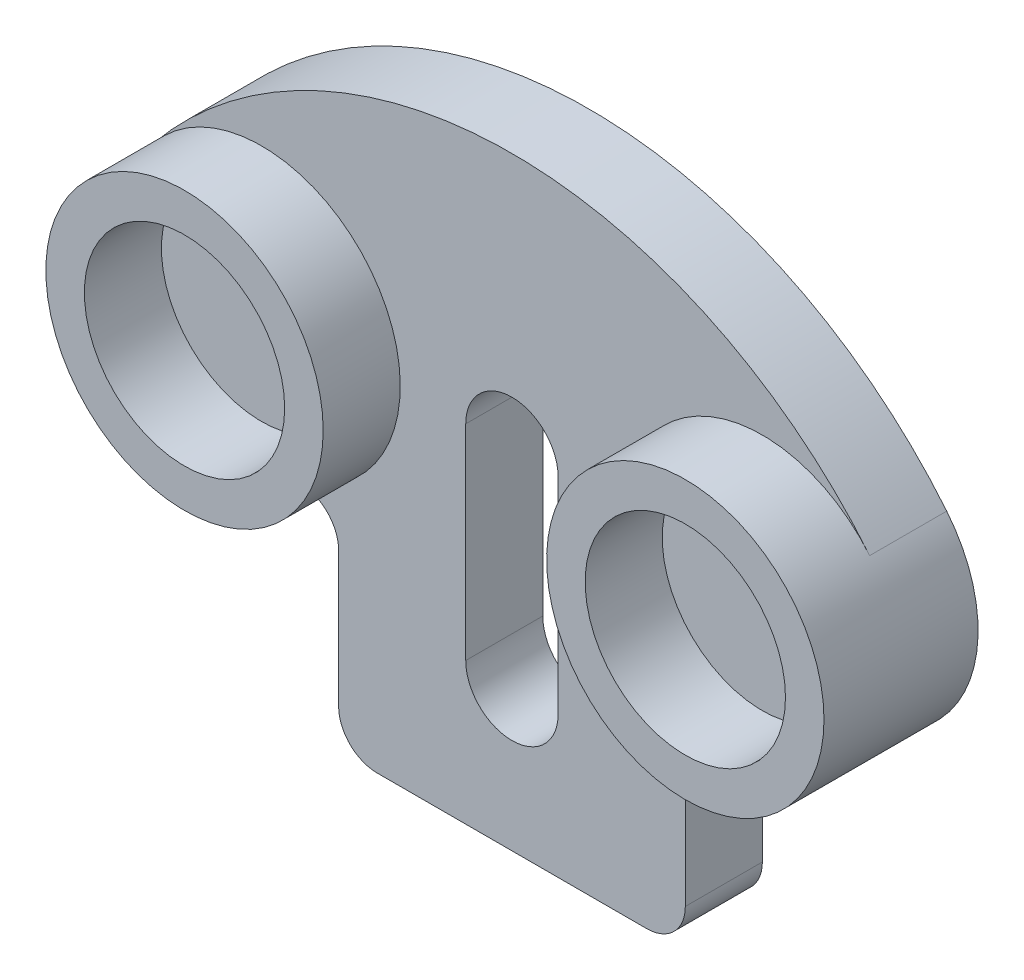
ISO-10303-21;
HEADER;
FILE_DESCRIPTION(('STEP AP214'),'2;1');
FILE_NAME('part.step','',(''),(''),'','','');
FILE_SCHEMA(('AUTOMOTIVE_DESIGN { 1 0 10303 214 1 1 1 1 }'));
ENDSEC;
DATA;
#1=APPLICATION_CONTEXT('core data for automotive mechanical design processes');
#2=APPLICATION_PROTOCOL_DEFINITION('international standard','automotive_design',2000,#1);
#3=PRODUCT_CONTEXT('',#1,'mechanical');
#4=PRODUCT('Part','Part','',(#3));
#5=PRODUCT_RELATED_PRODUCT_CATEGORY('part','',(#4));
#6=PRODUCT_DEFINITION_FORMATION('','',#4);
#7=PRODUCT_DEFINITION_CONTEXT('part definition',#1,'design');
#8=PRODUCT_DEFINITION('design','',#6,#7);
#9=PRODUCT_DEFINITION_SHAPE('','',#8);
#10=(LENGTH_UNIT() NAMED_UNIT(*) SI_UNIT(.MILLI.,.METRE.));
#11=(NAMED_UNIT(*) PLANE_ANGLE_UNIT() SI_UNIT($,.RADIAN.));
#12=(NAMED_UNIT(*) SI_UNIT($,.STERADIAN.) SOLID_ANGLE_UNIT());
#13=UNCERTAINTY_MEASURE_WITH_UNIT(LENGTH_MEASURE(1.E-05),#10,'distance_accuracy_value','');
#14=(GEOMETRIC_REPRESENTATION_CONTEXT(3) GLOBAL_UNCERTAINTY_ASSIGNED_CONTEXT((#13)) GLOBAL_UNIT_ASSIGNED_CONTEXT((#10,
#11,#12)) REPRESENTATION_CONTEXT('',''));
#15=CARTESIAN_POINT('',(0.,0.,0.));
#16=DIRECTION('',(0.,0.,1.));
#17=DIRECTION('',(1.,0.,0.));
#18=AXIS2_PLACEMENT_3D('',#15,#16,#17);
#19=CARTESIAN_POINT('',(0.,0.,10.));
#20=DIRECTION('',(0.,0.,1.));
#21=DIRECTION('',(1.,0.,0.));
#22=AXIS2_PLACEMENT_3D('',#19,#20,#21);
#23=PLANE('',#22);
#24=CARTESIAN_POINT('',(0.,26.6035711888461,10.));
#25=DIRECTION('',(0.,0.,1.));
#26=DIRECTION('',(1.,0.,0.));
#27=AXIS2_PLACEMENT_3D('',#24,#25,#26);
#28=CIRCLE('',#27,6.00000000000001);
#29=CARTESIAN_POINT('',(6.00000000000001,26.6035711888461,10.));
#30=VERTEX_POINT('',#29);
#31=CARTESIAN_POINT('',(-6.00000000000001,26.6035711888461,10.));
#32=VERTEX_POINT('',#31);
#33=EDGE_CURVE('E241',#30,#32,#28,.T.);
#34=ORIENTED_EDGE('',*,*,#33,.F.);
#35=DIRECTION('',(0.,-1.,0.));
#36=VECTOR('',#35,1.);
#37=CARTESIAN_POINT('',(6.,0.,10.));
#38=LINE('',#37,#36);
#39=CARTESIAN_POINT('',(6.,0.,10.));
#40=VERTEX_POINT('',#39);
#41=EDGE_CURVE('E298',#30,#40,#38,.T.);
#42=ORIENTED_EDGE('',*,*,#41,.T.);
#43=CARTESIAN_POINT('',(0.,0.,10.));
#44=DIRECTION('',(0.,0.,1.));
#45=DIRECTION('',(1.,0.,0.));
#46=AXIS2_PLACEMENT_3D('',#43,#44,#45);
#47=CIRCLE('',#46,6.);
#48=CARTESIAN_POINT('',(-6.,0.,10.));
#49=VERTEX_POINT('',#48);
#50=EDGE_CURVE('E300',#49,#40,#47,.T.);
#51=ORIENTED_EDGE('',*,*,#50,.F.);
#52=DIRECTION('',(0.,1.,0.));
#53=VECTOR('',#52,1.);
#54=CARTESIAN_POINT('',(-6.,0.,10.));
#55=LINE('',#54,#53);
#56=EDGE_CURVE('E293',#49,#32,#55,.T.);
#57=ORIENTED_EDGE('',*,*,#56,.T.);
#58=EDGE_LOOP('',(#34,#42,#51,#57));
#59=FACE_BOUND('',#58,.T.);
#60=CARTESIAN_POINT('',(0.,0.,10.));
#61=DIRECTION('',(0.,0.,1.));
#62=DIRECTION('',(1.,0.,0.));
#63=AXIS2_PLACEMENT_3D('',#60,#61,#62);
#64=CIRCLE('',#63,60.);
#65=CARTESIAN_POINT('',(46.4285714285714,38.0051016983515,10.));
#66=VERTEX_POINT('',#65);
#67=CARTESIAN_POINT('',(-46.4285714285714,38.0051016983515,10.));
#68=VERTEX_POINT('',#67);
#69=EDGE_CURVE('E285',#66,#68,#64,.T.);
#70=ORIENTED_EDGE('',*,*,#69,.T.);
#71=CARTESIAN_POINT('',(-32.5,26.6035711888461,10.));
#72=DIRECTION('',(0.,0.,1.));
#73=DIRECTION('',(1.,0.,0.));
#74=AXIS2_PLACEMENT_3D('',#71,#72,#73);
#75=CIRCLE('',#74,18.);
#76=CARTESIAN_POINT('',(-28.5869565217391,9.0340495466032,10.));
#77=VERTEX_POINT('',#76);
#78=EDGE_CURVE('E85',#68,#77,#75,.F.);
#79=ORIENTED_EDGE('',*,*,#78,.T.);
#80=CARTESIAN_POINT('',(-27.5,4.1536268682024,10.));
#81=DIRECTION('',(0.,0.,1.));
#82=DIRECTION('',(1.,0.,0.));
#83=AXIS2_PLACEMENT_3D('',#80,#81,#82);
#84=CIRCLE('',#83,5.);
#85=CARTESIAN_POINT('',(-22.5,4.1536268682024,10.));
#86=VERTEX_POINT('',#85);
#87=EDGE_CURVE('E279',#86,#77,#84,.T.);
#88=ORIENTED_EDGE('',*,*,#87,.F.);
#89=DIRECTION('',(0.,1.,0.));
#90=VECTOR('',#89,1.);
#91=CARTESIAN_POINT('',(-22.5,0.,10.));
#92=LINE('',#91,#90);
#93=CARTESIAN_POINT('',(-22.5,-13.3964288111539,10.));
#94=VERTEX_POINT('',#93);
#95=EDGE_CURVE('E204',#94,#86,#92,.T.);
#96=ORIENTED_EDGE('',*,*,#95,.F.);
#97=CARTESIAN_POINT('',(-17.5,-13.3964288111539,10.));
#98=DIRECTION('',(0.,0.,1.));
#99=DIRECTION('',(1.,0.,0.));
#100=AXIS2_PLACEMENT_3D('',#97,#98,#99);
#101=CIRCLE('',#100,5.);
#102=CARTESIAN_POINT('',(-17.5,-18.3964288111539,10.));
#103=VERTEX_POINT('',#102);
#104=EDGE_CURVE('E205',#103,#94,#101,.F.);
#105=ORIENTED_EDGE('',*,*,#104,.F.);
#106=DIRECTION('',(-1.,0.,0.));
#107=VECTOR('',#106,1.);
#108=CARTESIAN_POINT('',(0.,-18.3964288111539,10.));
#109=LINE('',#108,#107);
#110=CARTESIAN_POINT('',(17.5,-18.3964288111539,10.));
#111=VERTEX_POINT('',#110);
#112=EDGE_CURVE('E186',#111,#103,#109,.T.);
#113=ORIENTED_EDGE('',*,*,#112,.F.);
#114=CARTESIAN_POINT('',(17.5,-13.3964288111539,10.));
#115=DIRECTION('',(0.,0.,1.));
#116=DIRECTION('',(1.,0.,0.));
#117=AXIS2_PLACEMENT_3D('',#114,#115,#116);
#118=CIRCLE('',#117,5.);
#119=CARTESIAN_POINT('',(22.5,-13.3964288111539,10.));
#120=VERTEX_POINT('',#119);
#121=EDGE_CURVE('E195',#111,#120,#118,.T.);
#122=ORIENTED_EDGE('',*,*,#121,.T.);
#123=DIRECTION('',(0.,1.,0.));
#124=VECTOR('',#123,1.);
#125=CARTESIAN_POINT('',(22.5,0.,10.));
#126=LINE('',#125,#124);
#127=CARTESIAN_POINT('',(22.5,4.1536268682024,10.));
#128=VERTEX_POINT('',#127);
#129=EDGE_CURVE('E91',#120,#128,#126,.T.);
#130=ORIENTED_EDGE('',*,*,#129,.T.);
#131=CARTESIAN_POINT('',(27.5,4.1536268682024,10.));
#132=DIRECTION('',(0.,0.,1.));
#133=DIRECTION('',(1.,0.,0.));
#134=AXIS2_PLACEMENT_3D('',#131,#132,#133);
#135=CIRCLE('',#134,5.);
#136=CARTESIAN_POINT('',(28.5869565217391,9.03404954660319,10.));
#137=VERTEX_POINT('',#136);
#138=EDGE_CURVE('E292',#128,#137,#135,.F.);
#139=ORIENTED_EDGE('',*,*,#138,.T.);
#140=CARTESIAN_POINT('',(32.5,26.6035711888461,10.));
#141=DIRECTION('',(0.,0.,1.));
#142=DIRECTION('',(1.,0.,0.));
#143=AXIS2_PLACEMENT_3D('',#140,#141,#142);
#144=CIRCLE('',#143,18.);
#145=EDGE_CURVE('E261',#66,#137,#144,.T.);
#146=ORIENTED_EDGE('',*,*,#145,.F.);
#147=EDGE_LOOP('',(#70,#79,#88,#96,#105,#113,#122,#130,#139,#146));
#148=FACE_BOUND('',#147,.T.);
#149=ADVANCED_FACE('F77',(#59,#148),#23,.T.);
#150=CARTESIAN_POINT('',(32.5,26.6035711888461,10.));
#151=DIRECTION('',(0.,0.,-1.));
#152=DIRECTION('',(-1.,0.,0.));
#153=AXIS2_PLACEMENT_3D('',#150,#151,#152);
#154=CYLINDRICAL_SURFACE('',#153,18.);
#155=CARTESIAN_POINT('',(32.5,26.6035711888461,0.));
#156=DIRECTION('',(0.,0.,1.));
#157=DIRECTION('',(1.,0.,0.));
#158=AXIS2_PLACEMENT_3D('',#155,#156,#157);
#159=CIRCLE('',#158,18.);
#160=CARTESIAN_POINT('',(46.4285714285714,38.0051016983515,0.));
#161=VERTEX_POINT('',#160);
#162=CARTESIAN_POINT('',(28.5869565217391,9.03404954660319,0.));
#163=VERTEX_POINT('',#162);
#164=EDGE_CURVE('E227',#161,#163,#159,.F.);
#165=ORIENTED_EDGE('',*,*,#164,.F.);
#166=DIRECTION('',(0.,0.,-1.));
#167=VECTOR('',#166,1.);
#168=CARTESIAN_POINT('',(46.4285714285714,38.0051016983515,10.));
#169=LINE('',#168,#167);
#170=EDGE_CURVE('E260',#66,#161,#169,.T.);
#171=ORIENTED_EDGE('',*,*,#170,.F.);
#172=ORIENTED_EDGE('',*,*,#145,.T.);
#173=DIRECTION('',(0.,0.,-1.));
#174=VECTOR('',#173,1.);
#175=CARTESIAN_POINT('',(28.5869565217391,9.03404954660319,10.));
#176=LINE('',#175,#174);
#177=EDGE_CURVE('E259',#137,#163,#176,.T.);
#178=ORIENTED_EDGE('',*,*,#177,.T.);
#179=EDGE_LOOP('',(#165,#171,#172,#178));
#180=FACE_BOUND('',#179,.T.);
#181=CARTESIAN_POINT('',(32.5,26.6035711888461,20.));
#182=DIRECTION('',(0.,0.,1.));
#183=DIRECTION('',(1.,0.,0.));
#184=AXIS2_PLACEMENT_3D('',#181,#182,#183);
#185=CIRCLE('',#184,18.);
#186=CARTESIAN_POINT('',(50.5,26.6035711888461,20.));
#187=VERTEX_POINT('',#186);
#188=EDGE_CURVE('E307',#187,#187,#185,.F.);
#189=ORIENTED_EDGE('',*,*,#188,.T.);
#190=EDGE_LOOP('',(#189));
#191=FACE_BOUND('',#190,.T.);
#192=ADVANCED_FACE('F340',(#180,#191),#154,.T.);
#193=CARTESIAN_POINT('',(0.,0.,10.));
#194=DIRECTION('',(0.,0.,-1.));
#195=DIRECTION('',(-1.,0.,0.));
#196=AXIS2_PLACEMENT_3D('',#193,#194,#195);
#197=CYLINDRICAL_SURFACE('',#196,60.);
#198=CARTESIAN_POINT('',(0.,0.,0.));
#199=DIRECTION('',(0.,0.,1.));
#200=DIRECTION('',(1.,0.,0.));
#201=AXIS2_PLACEMENT_3D('',#198,#199,#200);
#202=CIRCLE('',#201,60.);
#203=CARTESIAN_POINT('',(-46.4285714285714,38.0051016983515,0.));
#204=VERTEX_POINT('',#203);
#205=EDGE_CURVE('E226',#161,#204,#202,.T.);
#206=ORIENTED_EDGE('',*,*,#205,.T.);
#207=DIRECTION('',(0.,0.,-1.));
#208=VECTOR('',#207,1.);
#209=CARTESIAN_POINT('',(-46.4285714285714,38.0051016983515,10.));
#210=LINE('',#209,#208);
#211=EDGE_CURVE('E254',#68,#204,#210,.T.);
#212=ORIENTED_EDGE('',*,*,#211,.F.);
#213=ORIENTED_EDGE('',*,*,#69,.F.);
#214=ORIENTED_EDGE('',*,*,#170,.T.);
#215=EDGE_LOOP('',(#206,#212,#213,#214));
#216=FACE_BOUND('',#215,.T.);
#217=ADVANCED_FACE('F345',(#216),#197,.T.);
#218=CARTESIAN_POINT('',(-27.5,4.1536268682024,10.));
#219=DIRECTION('',(0.,0.,-1.));
#220=DIRECTION('',(-1.,0.,0.));
#221=AXIS2_PLACEMENT_3D('',#218,#219,#220);
#222=CYLINDRICAL_SURFACE('',#221,5.);
#223=CARTESIAN_POINT('',(-27.5,4.1536268682024,0.));
#224=DIRECTION('',(0.,0.,1.));
#225=DIRECTION('',(1.,0.,0.));
#226=AXIS2_PLACEMENT_3D('',#223,#224,#225);
#227=CIRCLE('',#226,5.);
#228=CARTESIAN_POINT('',(-22.5,4.1536268682024,0.));
#229=VERTEX_POINT('',#228);
#230=CARTESIAN_POINT('',(-28.5869565217391,9.0340495466032,0.));
#231=VERTEX_POINT('',#230);
#232=EDGE_CURVE('E232',#229,#231,#227,.T.);
#233=ORIENTED_EDGE('',*,*,#232,.F.);
#234=DIRECTION('',(0.,0.,-1.));
#235=VECTOR('',#234,1.);
#236=CARTESIAN_POINT('',(-22.5,4.1536268682024,10.));
#237=LINE('',#236,#235);
#238=EDGE_CURVE('E253',#86,#229,#237,.T.);
#239=ORIENTED_EDGE('',*,*,#238,.F.);
#240=ORIENTED_EDGE('',*,*,#87,.T.);
#241=DIRECTION('',(0.,0.,-1.));
#242=VECTOR('',#241,1.);
#243=CARTESIAN_POINT('',(-28.5869565217391,9.0340495466032,10.));
#244=LINE('',#243,#242);
#245=EDGE_CURVE('E251',#77,#231,#244,.T.);
#246=ORIENTED_EDGE('',*,*,#245,.T.);
#247=EDGE_LOOP('',(#233,#239,#240,#246));
#248=FACE_BOUND('',#247,.T.);
#249=ADVANCED_FACE('F288',(#248),#222,.F.);
#250=CARTESIAN_POINT('',(-22.5,0.,10.));
#251=DIRECTION('',(-1.,0.,0.));
#252=DIRECTION('',(0.,0.,1.));
#253=AXIS2_PLACEMENT_3D('',#250,#251,#252);
#254=PLANE('',#253);
#255=DIRECTION('',(0.,1.,0.));
#256=VECTOR('',#255,1.);
#257=CARTESIAN_POINT('',(-22.5,0.,0.));
#258=LINE('',#257,#256);
#259=CARTESIAN_POINT('',(-22.5,-13.3964288111539,0.));
#260=VERTEX_POINT('',#259);
#261=EDGE_CURVE('E235',#260,#229,#258,.T.);
#262=ORIENTED_EDGE('',*,*,#261,.F.);
#263=DIRECTION('',(0.,0.,-1.));
#264=VECTOR('',#263,1.);
#265=CARTESIAN_POINT('',(-22.5,-13.3964288111539,10.));
#266=LINE('',#265,#264);
#267=EDGE_CURVE('E248',#94,#260,#266,.T.);
#268=ORIENTED_EDGE('',*,*,#267,.F.);
#269=ORIENTED_EDGE('',*,*,#95,.T.);
#270=ORIENTED_EDGE('',*,*,#238,.T.);
#271=EDGE_LOOP('',(#262,#268,#269,#270));
#272=FACE_BOUND('',#271,.T.);
#273=ADVANCED_FACE('F491',(#272),#254,.T.);
#274=CARTESIAN_POINT('',(-17.5,-13.3964288111539,10.));
#275=DIRECTION('',(0.,0.,-1.));
#276=DIRECTION('',(-1.,0.,0.));
#277=AXIS2_PLACEMENT_3D('',#274,#275,#276);
#278=CYLINDRICAL_SURFACE('',#277,5.);
#279=CARTESIAN_POINT('',(-17.5,-13.3964288111539,0.));
#280=DIRECTION('',(0.,0.,1.));
#281=DIRECTION('',(1.,0.,0.));
#282=AXIS2_PLACEMENT_3D('',#279,#280,#281);
#283=CIRCLE('',#282,5.);
#284=CARTESIAN_POINT('',(-17.5,-18.3964288111539,0.));
#285=VERTEX_POINT('',#284);
#286=EDGE_CURVE('E236',#285,#260,#283,.F.);
#287=ORIENTED_EDGE('',*,*,#286,.F.);
#288=DIRECTION('',(0.,0.,-1.));
#289=VECTOR('',#288,1.);
#290=CARTESIAN_POINT('',(-17.5,-18.3964288111539,10.));
#291=LINE('',#290,#289);
#292=EDGE_CURVE('E192',#103,#285,#291,.T.);
#293=ORIENTED_EDGE('',*,*,#292,.F.);
#294=ORIENTED_EDGE('',*,*,#104,.T.);
#295=ORIENTED_EDGE('',*,*,#267,.T.);
#296=EDGE_LOOP('',(#287,#293,#294,#295));
#297=FACE_BOUND('',#296,.T.);
#298=ADVANCED_FACE('F483',(#297),#278,.T.);
#299=CARTESIAN_POINT('',(0.,-18.3964288111539,10.));
#300=DIRECTION('',(0.,-1.,0.));
#301=DIRECTION('',(0.,0.,-1.));
#302=AXIS2_PLACEMENT_3D('',#299,#300,#301);
#303=PLANE('',#302);
#304=DIRECTION('',(-1.,0.,0.));
#305=VECTOR('',#304,1.);
#306=CARTESIAN_POINT('',(0.,-18.3964288111539,0.));
#307=LINE('',#306,#305);
#308=CARTESIAN_POINT('',(17.5,-18.3964288111539,0.));
#309=VERTEX_POINT('',#308);
#310=EDGE_CURVE('E191',#309,#285,#307,.T.);
#311=ORIENTED_EDGE('',*,*,#310,.F.);
#312=DIRECTION('',(0.,0.,-1.));
#313=VECTOR('',#312,1.);
#314=CARTESIAN_POINT('',(17.5,-18.3964288111539,10.));
#315=LINE('',#314,#313);
#316=EDGE_CURVE('E183',#111,#309,#315,.T.);
#317=ORIENTED_EDGE('',*,*,#316,.F.);
#318=ORIENTED_EDGE('',*,*,#112,.T.);
#319=ORIENTED_EDGE('',*,*,#292,.T.);
#320=EDGE_LOOP('',(#311,#317,#318,#319));
#321=FACE_BOUND('',#320,.T.);
#322=ADVANCED_FACE('F190',(#321),#303,.T.);
#323=CARTESIAN_POINT('',(17.5,-13.3964288111539,10.));
#324=DIRECTION('',(0.,0.,-1.));
#325=DIRECTION('',(-1.,0.,0.));
#326=AXIS2_PLACEMENT_3D('',#323,#324,#325);
#327=CYLINDRICAL_SURFACE('',#326,5.);
#328=CARTESIAN_POINT('',(17.5,-13.3964288111539,0.));
#329=DIRECTION('',(0.,0.,1.));
#330=DIRECTION('',(1.,0.,0.));
#331=AXIS2_PLACEMENT_3D('',#328,#329,#330);
#332=CIRCLE('',#331,5.);
#333=CARTESIAN_POINT('',(22.5,-13.3964288111539,0.));
#334=VERTEX_POINT('',#333);
#335=EDGE_CURVE('E140',#309,#334,#332,.T.);
#336=ORIENTED_EDGE('',*,*,#335,.T.);
#337=DIRECTION('',(0.,0.,-1.));
#338=VECTOR('',#337,1.);
#339=CARTESIAN_POINT('',(22.5,-13.3964288111539,10.));
#340=LINE('',#339,#338);
#341=EDGE_CURVE('E194',#120,#334,#340,.T.);
#342=ORIENTED_EDGE('',*,*,#341,.F.);
#343=ORIENTED_EDGE('',*,*,#121,.F.);
#344=ORIENTED_EDGE('',*,*,#316,.T.);
#345=EDGE_LOOP('',(#336,#342,#343,#344));
#346=FACE_BOUND('',#345,.T.);
#347=ADVANCED_FACE('F198',(#346),#327,.T.);
#348=CARTESIAN_POINT('',(22.5,0.,10.));
#349=DIRECTION('',(-1.,0.,0.));
#350=DIRECTION('',(0.,0.,1.));
#351=AXIS2_PLACEMENT_3D('',#348,#349,#350);
#352=PLANE('',#351);
#353=DIRECTION('',(0.,1.,0.));
#354=VECTOR('',#353,1.);
#355=CARTESIAN_POINT('',(22.5,0.,0.));
#356=LINE('',#355,#354);
#357=CARTESIAN_POINT('',(22.5,4.1536268682024,0.));
#358=VERTEX_POINT('',#357);
#359=EDGE_CURVE('E148',#334,#358,#356,.T.);
#360=ORIENTED_EDGE('',*,*,#359,.T.);
#361=DIRECTION('',(0.,0.,-1.));
#362=VECTOR('',#361,1.);
#363=CARTESIAN_POINT('',(22.5,4.1536268682024,10.));
#364=LINE('',#363,#362);
#365=EDGE_CURVE('E243',#128,#358,#364,.T.);
#366=ORIENTED_EDGE('',*,*,#365,.F.);
#367=ORIENTED_EDGE('',*,*,#129,.F.);
#368=ORIENTED_EDGE('',*,*,#341,.T.);
#369=EDGE_LOOP('',(#360,#366,#367,#368));
#370=FACE_BOUND('',#369,.T.);
#371=ADVANCED_FACE('F458',(#370),#352,.F.);
#372=CARTESIAN_POINT('',(27.5,4.1536268682024,10.));
#373=DIRECTION('',(0.,0.,-1.));
#374=DIRECTION('',(-1.,0.,0.));
#375=AXIS2_PLACEMENT_3D('',#372,#373,#374);
#376=CYLINDRICAL_SURFACE('',#375,5.);
#377=CARTESIAN_POINT('',(27.5,4.1536268682024,0.));
#378=DIRECTION('',(0.,0.,1.));
#379=DIRECTION('',(1.,0.,0.));
#380=AXIS2_PLACEMENT_3D('',#377,#378,#379);
#381=CIRCLE('',#380,5.);
#382=EDGE_CURVE('E224',#358,#163,#381,.F.);
#383=ORIENTED_EDGE('',*,*,#382,.T.);
#384=ORIENTED_EDGE('',*,*,#177,.F.);
#385=ORIENTED_EDGE('',*,*,#138,.F.);
#386=ORIENTED_EDGE('',*,*,#365,.T.);
#387=EDGE_LOOP('',(#383,#384,#385,#386));
#388=FACE_BOUND('',#387,.T.);
#389=ADVANCED_FACE('F451',(#388),#376,.F.);
#390=CARTESIAN_POINT('',(6.,0.,10.));
#391=DIRECTION('',(1.,0.,0.));
#392=DIRECTION('',(0.,1.,0.));
#393=AXIS2_PLACEMENT_3D('',#390,#391,#392);
#394=PLANE('',#393);
#395=DIRECTION('',(0.,-1.,0.));
#396=VECTOR('',#395,1.);
#397=CARTESIAN_POINT('',(6.,0.,0.));
#398=LINE('',#397,#396);
#399=CARTESIAN_POINT('',(6.00000000000001,26.6035711888461,0.));
#400=VERTEX_POINT('',#399);
#401=CARTESIAN_POINT('',(6.,0.,0.));
#402=VERTEX_POINT('',#401);
#403=EDGE_CURVE('E213',#400,#402,#398,.T.);
#404=ORIENTED_EDGE('',*,*,#403,.T.);
#405=DIRECTION('',(0.,0.,-1.));
#406=VECTOR('',#405,1.);
#407=CARTESIAN_POINT('',(6.,0.,10.));
#408=LINE('',#407,#406);
#409=EDGE_CURVE('E264',#40,#402,#408,.T.);
#410=ORIENTED_EDGE('',*,*,#409,.F.);
#411=ORIENTED_EDGE('',*,*,#41,.F.);
#412=DIRECTION('',(0.,0.,-1.));
#413=VECTOR('',#412,1.);
#414=CARTESIAN_POINT('',(6.00000000000001,26.6035711888461,10.));
#415=LINE('',#414,#413);
#416=EDGE_CURVE('E152',#30,#400,#415,.T.);
#417=ORIENTED_EDGE('',*,*,#416,.T.);
#418=EDGE_LOOP('',(#404,#410,#411,#417));
#419=FACE_BOUND('',#418,.T.);
#420=ADVANCED_FACE('F445',(#419),#394,.F.);
#421=CARTESIAN_POINT('',(0.,0.,10.));
#422=DIRECTION('',(0.,0.,-1.));
#423=DIRECTION('',(-1.,0.,0.));
#424=AXIS2_PLACEMENT_3D('',#421,#422,#423);
#425=CYLINDRICAL_SURFACE('',#424,6.);
#426=CARTESIAN_POINT('',(0.,0.,0.));
#427=DIRECTION('',(0.,0.,1.));
#428=DIRECTION('',(1.,0.,0.));
#429=AXIS2_PLACEMENT_3D('',#426,#427,#428);
#430=CIRCLE('',#429,6.);
#431=CARTESIAN_POINT('',(-6.,0.,0.));
#432=VERTEX_POINT('',#431);
#433=EDGE_CURVE('E220',#432,#402,#430,.T.);
#434=ORIENTED_EDGE('',*,*,#433,.F.);
#435=DIRECTION('',(0.,0.,-1.));
#436=VECTOR('',#435,1.);
#437=CARTESIAN_POINT('',(-6.,0.,10.));
#438=LINE('',#437,#436);
#439=EDGE_CURVE('E263',#49,#432,#438,.T.);
#440=ORIENTED_EDGE('',*,*,#439,.F.);
#441=ORIENTED_EDGE('',*,*,#50,.T.);
#442=ORIENTED_EDGE('',*,*,#409,.T.);
#443=EDGE_LOOP('',(#434,#440,#441,#442));
#444=FACE_BOUND('',#443,.T.);
#445=ADVANCED_FACE('F433',(#444),#425,.F.);
#446=CARTESIAN_POINT('',(-6.,0.,10.));
#447=DIRECTION('',(-1.,0.,0.));
#448=DIRECTION('',(0.,-1.,0.));
#449=AXIS2_PLACEMENT_3D('',#446,#447,#448);
#450=PLANE('',#449);
#451=DIRECTION('',(0.,1.,0.));
#452=VECTOR('',#451,1.);
#453=CARTESIAN_POINT('',(-6.,0.,0.));
#454=LINE('',#453,#452);
#455=CARTESIAN_POINT('',(-6.00000000000001,26.6035711888461,0.));
#456=VERTEX_POINT('',#455);
#457=EDGE_CURVE('E219',#432,#456,#454,.T.);
#458=ORIENTED_EDGE('',*,*,#457,.T.);
#459=DIRECTION('',(0.,0.,-1.));
#460=VECTOR('',#459,1.);
#461=CARTESIAN_POINT('',(-6.00000000000001,26.6035711888461,10.));
#462=LINE('',#461,#460);
#463=EDGE_CURVE('E207',#32,#456,#462,.T.);
#464=ORIENTED_EDGE('',*,*,#463,.F.);
#465=ORIENTED_EDGE('',*,*,#56,.F.);
#466=ORIENTED_EDGE('',*,*,#439,.T.);
#467=EDGE_LOOP('',(#458,#464,#465,#466));
#468=FACE_BOUND('',#467,.T.);
#469=ADVANCED_FACE('F426',(#468),#450,.F.);
#470=CARTESIAN_POINT('',(0.,26.6035711888461,10.));
#471=DIRECTION('',(0.,0.,-1.));
#472=DIRECTION('',(-1.,0.,0.));
#473=AXIS2_PLACEMENT_3D('',#470,#471,#472);
#474=CYLINDRICAL_SURFACE('',#473,6.00000000000001);
#475=CARTESIAN_POINT('',(0.,26.6035711888461,0.));
#476=DIRECTION('',(0.,0.,1.));
#477=DIRECTION('',(1.,0.,0.));
#478=AXIS2_PLACEMENT_3D('',#475,#476,#477);
#479=CIRCLE('',#478,6.00000000000001);
#480=EDGE_CURVE('E209',#400,#456,#479,.T.);
#481=ORIENTED_EDGE('',*,*,#480,.F.);
#482=ORIENTED_EDGE('',*,*,#416,.F.);
#483=ORIENTED_EDGE('',*,*,#33,.T.);
#484=ORIENTED_EDGE('',*,*,#463,.T.);
#485=EDGE_LOOP('',(#481,#482,#483,#484));
#486=FACE_BOUND('',#485,.T.);
#487=ADVANCED_FACE('F334',(#486),#474,.F.);
#488=CARTESIAN_POINT('',(0.,0.,0.));
#489=DIRECTION('',(0.,0.,1.));
#490=DIRECTION('',(1.,0.,0.));
#491=AXIS2_PLACEMENT_3D('',#488,#489,#490);
#492=PLANE('',#491);
#493=CARTESIAN_POINT('',(-32.5,26.6035711888461,0.));
#494=DIRECTION('',(0.,0.,1.));
#495=DIRECTION('',(1.,0.,0.));
#496=AXIS2_PLACEMENT_3D('',#493,#494,#495);
#497=CIRCLE('',#496,18.);
#498=EDGE_CURVE('E212',#204,#231,#497,.T.);
#499=ORIENTED_EDGE('',*,*,#498,.F.);
#500=ORIENTED_EDGE('',*,*,#205,.F.);
#501=ORIENTED_EDGE('',*,*,#164,.T.);
#502=ORIENTED_EDGE('',*,*,#382,.F.);
#503=ORIENTED_EDGE('',*,*,#359,.F.);
#504=ORIENTED_EDGE('',*,*,#335,.F.);
#505=ORIENTED_EDGE('',*,*,#310,.T.);
#506=ORIENTED_EDGE('',*,*,#286,.T.);
#507=ORIENTED_EDGE('',*,*,#261,.T.);
#508=ORIENTED_EDGE('',*,*,#232,.T.);
#509=EDGE_LOOP('',(#499,#500,#501,#502,#503,#504,#505,#506,#507,#508));
#510=FACE_BOUND('',#509,.T.);
#511=ORIENTED_EDGE('',*,*,#480,.T.);
#512=ORIENTED_EDGE('',*,*,#457,.F.);
#513=ORIENTED_EDGE('',*,*,#433,.T.);
#514=ORIENTED_EDGE('',*,*,#403,.F.);
#515=EDGE_LOOP('',(#511,#512,#513,#514));
#516=FACE_BOUND('',#515,.T.);
#517=ADVANCED_FACE('F324',(#510,#516),#492,.F.);
#518=CARTESIAN_POINT('',(-32.5,26.6035711888461,10.));
#519=DIRECTION('',(0.,0.,-1.));
#520=DIRECTION('',(-1.,0.,0.));
#521=AXIS2_PLACEMENT_3D('',#518,#519,#520);
#522=CYLINDRICAL_SURFACE('',#521,18.);
#523=ORIENTED_EDGE('',*,*,#245,.F.);
#524=ORIENTED_EDGE('',*,*,#78,.F.);
#525=ORIENTED_EDGE('',*,*,#211,.T.);
#526=ORIENTED_EDGE('',*,*,#498,.T.);
#527=EDGE_LOOP('',(#523,#524,#525,#526));
#528=FACE_BOUND('',#527,.T.);
#529=CARTESIAN_POINT('',(-32.5,26.6035711888461,20.));
#530=DIRECTION('',(0.,0.,1.));
#531=DIRECTION('',(1.,0.,0.));
#532=AXIS2_PLACEMENT_3D('',#529,#530,#531);
#533=CIRCLE('',#532,18.);
#534=CARTESIAN_POINT('',(-14.5,26.6035711888461,20.));
#535=VERTEX_POINT('',#534);
#536=EDGE_CURVE('E272',#535,#535,#533,.T.);
#537=ORIENTED_EDGE('',*,*,#536,.F.);
#538=EDGE_LOOP('',(#537));
#539=FACE_BOUND('',#538,.T.);
#540=ADVANCED_FACE('F79',(#528,#539),#522,.T.);
#541=CARTESIAN_POINT('',(32.5,26.6035711888461,20.));
#542=DIRECTION('',(0.,0.,-1.));
#543=DIRECTION('',(-1.,0.,0.));
#544=AXIS2_PLACEMENT_3D('',#541,#542,#543);
#545=CYLINDRICAL_SURFACE('',#544,13.);
#546=CARTESIAN_POINT('',(32.5,26.6035711888461,10.));
#547=DIRECTION('',(0.,0.,1.));
#548=DIRECTION('',(1.,0.,0.));
#549=AXIS2_PLACEMENT_3D('',#546,#547,#548);
#550=CIRCLE('',#549,13.);
#551=CARTESIAN_POINT('',(45.5,26.6035711888461,10.));
#552=VERTEX_POINT('',#551);
#553=EDGE_CURVE('E269',#552,#552,#550,.T.);
#554=ORIENTED_EDGE('',*,*,#553,.F.);
#555=EDGE_LOOP('',(#554));
#556=FACE_BOUND('',#555,.T.);
#557=CARTESIAN_POINT('',(32.5,26.6035711888461,20.));
#558=DIRECTION('',(0.,0.,1.));
#559=DIRECTION('',(1.,0.,0.));
#560=AXIS2_PLACEMENT_3D('',#557,#558,#559);
#561=CIRCLE('',#560,13.);
#562=CARTESIAN_POINT('',(45.5,26.6035711888461,20.));
#563=VERTEX_POINT('',#562);
#564=EDGE_CURVE('E304',#563,#563,#561,.F.);
#565=ORIENTED_EDGE('',*,*,#564,.F.);
#566=EDGE_LOOP('',(#565));
#567=FACE_BOUND('',#566,.T.);
#568=ADVANCED_FACE('F322',(#556,#567),#545,.F.);
#569=CARTESIAN_POINT('',(0.,0.,20.));
#570=DIRECTION('',(0.,0.,1.));
#571=DIRECTION('',(1.,0.,0.));
#572=AXIS2_PLACEMENT_3D('',#569,#570,#571);
#573=PLANE('',#572);
#574=ORIENTED_EDGE('',*,*,#188,.F.);
#575=EDGE_LOOP('',(#574));
#576=FACE_BOUND('',#575,.T.);
#577=ORIENTED_EDGE('',*,*,#564,.T.);
#578=EDGE_LOOP('',(#577));
#579=FACE_BOUND('',#578,.T.);
#580=ADVANCED_FACE('F329',(#576,#579),#573,.T.);
#581=CARTESIAN_POINT('',(-32.5,26.6035711888461,20.));
#582=DIRECTION('',(0.,0.,-1.));
#583=DIRECTION('',(-1.,0.,0.));
#584=AXIS2_PLACEMENT_3D('',#581,#582,#583);
#585=CYLINDRICAL_SURFACE('',#584,13.);
#586=CARTESIAN_POINT('',(-32.5,26.6035711888461,10.));
#587=DIRECTION('',(0.,0.,1.));
#588=DIRECTION('',(1.,0.,0.));
#589=AXIS2_PLACEMENT_3D('',#586,#587,#588);
#590=CIRCLE('',#589,13.);
#591=CARTESIAN_POINT('',(-19.5,26.6035711888461,10.));
#592=VERTEX_POINT('',#591);
#593=EDGE_CURVE('E12',#592,#592,#590,.F.);
#594=ORIENTED_EDGE('',*,*,#593,.T.);
#595=EDGE_LOOP('',(#594));
#596=FACE_BOUND('',#595,.T.);
#597=CARTESIAN_POINT('',(-32.5,26.6035711888461,20.));
#598=DIRECTION('',(0.,0.,1.));
#599=DIRECTION('',(1.,0.,0.));
#600=AXIS2_PLACEMENT_3D('',#597,#598,#599);
#601=CIRCLE('',#600,13.);
#602=CARTESIAN_POINT('',(-19.5,26.6035711888461,20.));
#603=VERTEX_POINT('',#602);
#604=EDGE_CURVE('E308',#603,#603,#601,.T.);
#605=ORIENTED_EDGE('',*,*,#604,.T.);
#606=EDGE_LOOP('',(#605));
#607=FACE_BOUND('',#606,.T.);
#608=ADVANCED_FACE('F312',(#596,#607),#585,.F.);
#609=CARTESIAN_POINT('',(0.,0.,20.));
#610=DIRECTION('',(0.,0.,1.));
#611=DIRECTION('',(1.,0.,0.));
#612=AXIS2_PLACEMENT_3D('',#609,#610,#611);
#613=PLANE('',#612);
#614=ORIENTED_EDGE('',*,*,#604,.F.);
#615=EDGE_LOOP('',(#614));
#616=FACE_BOUND('',#615,.T.);
#617=ORIENTED_EDGE('',*,*,#536,.T.);
#618=EDGE_LOOP('',(#617));
#619=FACE_BOUND('',#618,.T.);
#620=ADVANCED_FACE('F320',(#616,#619),#613,.T.);
#621=ORIENTED_EDGE('',*,*,#593,.F.);
#622=EDGE_LOOP('',(#621));
#623=FACE_BOUND('',#622,.T.);
#624=ADVANCED_FACE('F319',(#623),#23,.T.);
#625=ORIENTED_EDGE('',*,*,#553,.T.);
#626=EDGE_LOOP('',(#625));
#627=FACE_BOUND('',#626,.T.);
#628=ADVANCED_FACE('F338',(#627),#23,.T.);
#629=CLOSED_SHELL('',(#149,#192,#217,#249,#273,#298,#322,#347,#371,#389,#420,#445,#469,#487,
#517,#540,#568,#580,#608,#620,#624,#628));
#630=MANIFOLD_SOLID_BREP('B2',#629);
#631=ADVANCED_BREP_SHAPE_REPRESENTATION('',(#18,#630),#14);
#632=SHAPE_DEFINITION_REPRESENTATION(#9,#631);
ENDSEC;
END-ISO-10303-21;
